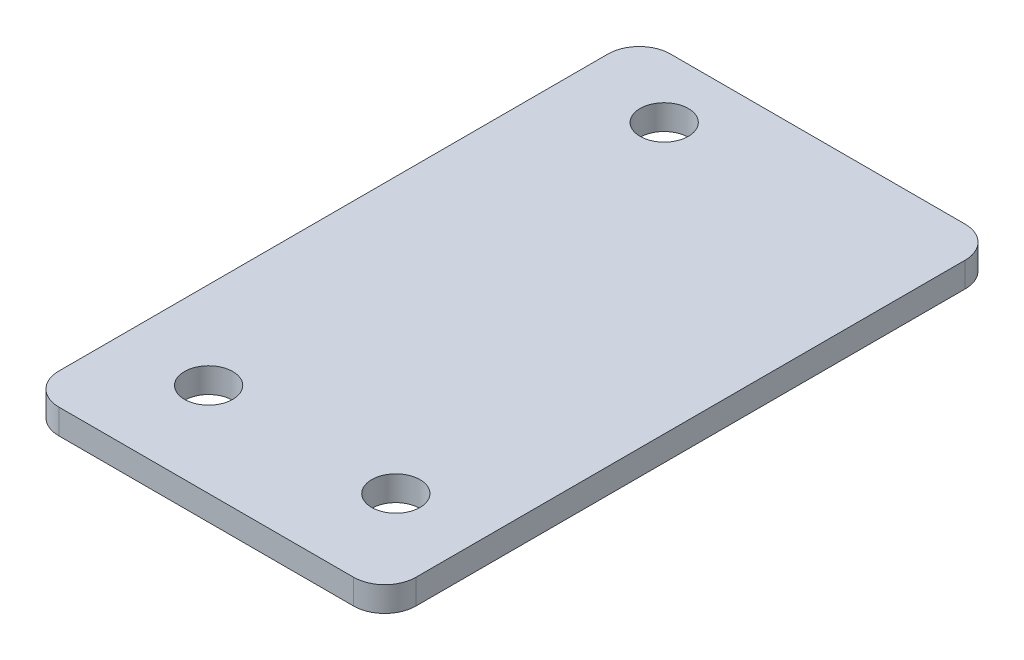
ISO-10303-21;
HEADER;
FILE_DESCRIPTION(('STEP AP214'),'2;1');
FILE_NAME('part.step','',(''),(''),'','','');
FILE_SCHEMA(('AUTOMOTIVE_DESIGN { 1 0 10303 214 1 1 1 1 }'));
ENDSEC;
DATA;
#1=APPLICATION_CONTEXT('core data for automotive mechanical design processes');
#2=APPLICATION_PROTOCOL_DEFINITION('international standard','automotive_design',2000,#1);
#3=PRODUCT_CONTEXT('',#1,'mechanical');
#4=PRODUCT('Part','Part','',(#3));
#5=PRODUCT_RELATED_PRODUCT_CATEGORY('part','',(#4));
#6=PRODUCT_DEFINITION_FORMATION('','',#4);
#7=PRODUCT_DEFINITION_CONTEXT('part definition',#1,'design');
#8=PRODUCT_DEFINITION('design','',#6,#7);
#9=PRODUCT_DEFINITION_SHAPE('','',#8);
#10=(LENGTH_UNIT() NAMED_UNIT(*) SI_UNIT(.MILLI.,.METRE.));
#11=(NAMED_UNIT(*) PLANE_ANGLE_UNIT() SI_UNIT($,.RADIAN.));
#12=(NAMED_UNIT(*) SI_UNIT($,.STERADIAN.) SOLID_ANGLE_UNIT());
#13=UNCERTAINTY_MEASURE_WITH_UNIT(LENGTH_MEASURE(1.E-05),#10,'distance_accuracy_value','');
#14=(GEOMETRIC_REPRESENTATION_CONTEXT(3) GLOBAL_UNCERTAINTY_ASSIGNED_CONTEXT((#13)) GLOBAL_UNIT_ASSIGNED_CONTEXT((#10,
#11,#12)) REPRESENTATION_CONTEXT('',''));
#15=CARTESIAN_POINT('',(0.,0.,0.));
#16=DIRECTION('',(0.,0.,1.));
#17=DIRECTION('',(1.,0.,0.));
#18=AXIS2_PLACEMENT_3D('',#15,#16,#17);
#19=CARTESIAN_POINT('',(33.1643599999993,-2.54,1.67766778092999));
#20=DIRECTION('',(0.,1.,0.));
#21=DIRECTION('',(0.,0.,1.));
#22=AXIS2_PLACEMENT_3D('',#19,#20,#21);
#23=CYLINDRICAL_SURFACE('',#22,3.175);
#24=CARTESIAN_POINT('',(33.1643599999993,0.,1.67766778092999));
#25=DIRECTION('',(0.,1.,0.));
#26=DIRECTION('',(0.,0.,-1.));
#27=AXIS2_PLACEMENT_3D('',#24,#25,#26);
#28=CIRCLE('',#27,3.175);
#29=CARTESIAN_POINT('',(33.1643599999993,0.,4.85266778092999));
#30=VERTEX_POINT('',#29);
#31=CARTESIAN_POINT('',(36.3393599999993,0.,1.67766778092999));
#32=VERTEX_POINT('',#31);
#33=EDGE_CURVE('E130',#30,#32,#28,.T.);
#34=ORIENTED_EDGE('',*,*,#33,.F.);
#35=DIRECTION('',(0.,1.,0.));
#36=VECTOR('',#35,1.);
#37=CARTESIAN_POINT('',(33.1643599999993,-2.54,4.85266778092999));
#38=LINE('',#37,#36);
#39=CARTESIAN_POINT('',(33.1643599999993,-2.54,4.85266778092999));
#40=VERTEX_POINT('',#39);
#41=EDGE_CURVE('E11',#40,#30,#38,.T.);
#42=ORIENTED_EDGE('',*,*,#41,.F.);
#43=CARTESIAN_POINT('',(33.1643599999993,-2.54,1.67766778092999));
#44=DIRECTION('',(0.,1.,0.));
#45=DIRECTION('',(0.,0.,-1.));
#46=AXIS2_PLACEMENT_3D('',#43,#44,#45);
#47=CIRCLE('',#46,3.175);
#48=CARTESIAN_POINT('',(36.3393599999993,-2.54,1.67766778092999));
#49=VERTEX_POINT('',#48);
#50=EDGE_CURVE('E151',#40,#49,#47,.T.);
#51=ORIENTED_EDGE('',*,*,#50,.T.);
#52=DIRECTION('',(0.,1.,0.));
#53=VECTOR('',#52,1.);
#54=CARTESIAN_POINT('',(36.3393599999993,-2.54,1.67766778092999));
#55=LINE('',#54,#53);
#56=EDGE_CURVE('E36',#49,#32,#55,.T.);
#57=ORIENTED_EDGE('',*,*,#56,.T.);
#58=EDGE_LOOP('',(#34,#42,#51,#57));
#59=FACE_BOUND('',#58,.T.);
#60=ADVANCED_FACE('F33',(#59),#23,.T.);
#61=CARTESIAN_POINT('',(3.175,-2.54,4.85266778092999));
#62=DIRECTION('',(0.,0.,1.));
#63=DIRECTION('',(1.,0.,0.));
#64=AXIS2_PLACEMENT_3D('',#61,#62,#63);
#65=PLANE('',#64);
#66=DIRECTION('',(1.,0.,0.));
#67=VECTOR('',#66,1.);
#68=CARTESIAN_POINT('',(3.175,0.,4.85266778092999));
#69=LINE('',#68,#67);
#70=CARTESIAN_POINT('',(3.175,0.,4.85266778092999));
#71=VERTEX_POINT('',#70);
#72=EDGE_CURVE('E149',#71,#30,#69,.T.);
#73=ORIENTED_EDGE('',*,*,#72,.F.);
#74=DIRECTION('',(0.,1.,0.));
#75=VECTOR('',#74,1.);
#76=CARTESIAN_POINT('',(3.175,-2.54,4.85266778092999));
#77=LINE('',#76,#75);
#78=CARTESIAN_POINT('',(3.175,-2.54,4.85266778092999));
#79=VERTEX_POINT('',#78);
#80=EDGE_CURVE('E42',#79,#71,#77,.T.);
#81=ORIENTED_EDGE('',*,*,#80,.F.);
#82=DIRECTION('',(1.,0.,0.));
#83=VECTOR('',#82,1.);
#84=CARTESIAN_POINT('',(3.175,-2.54,4.85266778092999));
#85=LINE('',#84,#83);
#86=EDGE_CURVE('E120',#79,#40,#85,.T.);
#87=ORIENTED_EDGE('',*,*,#86,.T.);
#88=ORIENTED_EDGE('',*,*,#41,.T.);
#89=EDGE_LOOP('',(#73,#81,#87,#88));
#90=FACE_BOUND('',#89,.T.);
#91=ADVANCED_FACE('F163',(#90),#65,.T.);
#92=CARTESIAN_POINT('',(3.175,-2.54,1.67766778092999));
#93=DIRECTION('',(0.,1.,0.));
#94=DIRECTION('',(0.,0.,1.));
#95=AXIS2_PLACEMENT_3D('',#92,#93,#94);
#96=CYLINDRICAL_SURFACE('',#95,3.175);
#97=CARTESIAN_POINT('',(3.175,0.,1.67766778092999));
#98=DIRECTION('',(0.,1.,0.));
#99=DIRECTION('',(0.,0.,1.));
#100=AXIS2_PLACEMENT_3D('',#97,#98,#99);
#101=CIRCLE('',#100,3.175);
#102=CARTESIAN_POINT('',(0.,0.,1.67766778092999));
#103=VERTEX_POINT('',#102);
#104=EDGE_CURVE('E107',#103,#71,#101,.T.);
#105=ORIENTED_EDGE('',*,*,#104,.F.);
#106=DIRECTION('',(0.,1.,0.));
#107=VECTOR('',#106,1.);
#108=CARTESIAN_POINT('',(0.,-2.54,1.67766778092999));
#109=LINE('',#108,#107);
#110=CARTESIAN_POINT('',(0.,-2.54,1.67766778092999));
#111=VERTEX_POINT('',#110);
#112=EDGE_CURVE('E102',#111,#103,#109,.T.);
#113=ORIENTED_EDGE('',*,*,#112,.F.);
#114=CARTESIAN_POINT('',(3.175,-2.54,1.67766778092999));
#115=DIRECTION('',(0.,1.,0.));
#116=DIRECTION('',(0.,0.,1.));
#117=AXIS2_PLACEMENT_3D('',#114,#115,#116);
#118=CIRCLE('',#117,3.175);
#119=EDGE_CURVE('E105',#111,#79,#118,.T.);
#120=ORIENTED_EDGE('',*,*,#119,.T.);
#121=ORIENTED_EDGE('',*,*,#80,.T.);
#122=EDGE_LOOP('',(#105,#113,#120,#121));
#123=FACE_BOUND('',#122,.T.);
#124=ADVANCED_FACE('F104',(#123),#96,.T.);
#125=CARTESIAN_POINT('',(0.,-2.54,1.67766778092999));
#126=DIRECTION('',(-1.,0.,0.));
#127=DIRECTION('',(0.,0.,1.));
#128=AXIS2_PLACEMENT_3D('',#125,#126,#127);
#129=PLANE('',#128);
#130=DIRECTION('',(0.,0.,1.));
#131=VECTOR('',#130,1.);
#132=CARTESIAN_POINT('',(0.,0.,1.67766778092999));
#133=LINE('',#132,#131);
#134=CARTESIAN_POINT('',(0.,0.,-54.20233221907));
#135=VERTEX_POINT('',#134);
#136=EDGE_CURVE('E146',#135,#103,#133,.T.);
#137=ORIENTED_EDGE('',*,*,#136,.F.);
#138=DIRECTION('',(0.,1.,0.));
#139=VECTOR('',#138,1.);
#140=CARTESIAN_POINT('',(0.,-2.54,-54.20233221907));
#141=LINE('',#140,#139);
#142=CARTESIAN_POINT('',(0.,-2.54,-54.20233221907));
#143=VERTEX_POINT('',#142);
#144=EDGE_CURVE('E112',#143,#135,#141,.T.);
#145=ORIENTED_EDGE('',*,*,#144,.F.);
#146=DIRECTION('',(0.,0.,1.));
#147=VECTOR('',#146,1.);
#148=CARTESIAN_POINT('',(0.,-2.54,1.67766778092999));
#149=LINE('',#148,#147);
#150=EDGE_CURVE('E118',#143,#111,#149,.T.);
#151=ORIENTED_EDGE('',*,*,#150,.T.);
#152=ORIENTED_EDGE('',*,*,#112,.T.);
#153=EDGE_LOOP('',(#137,#145,#151,#152));
#154=FACE_BOUND('',#153,.T.);
#155=ADVANCED_FACE('F122',(#154),#129,.T.);
#156=CARTESIAN_POINT('',(3.175,-2.54,-54.20233221907));
#157=DIRECTION('',(0.,1.,0.));
#158=DIRECTION('',(0.,0.,1.));
#159=AXIS2_PLACEMENT_3D('',#156,#157,#158);
#160=CYLINDRICAL_SURFACE('',#159,3.175);
#161=CARTESIAN_POINT('',(3.175,0.,-54.20233221907));
#162=DIRECTION('',(0.,1.,0.));
#163=DIRECTION('',(0.,0.,-1.));
#164=AXIS2_PLACEMENT_3D('',#161,#162,#163);
#165=CIRCLE('',#164,3.175);
#166=CARTESIAN_POINT('',(3.175,0.,-57.37733221907));
#167=VERTEX_POINT('',#166);
#168=EDGE_CURVE('E143',#167,#135,#165,.T.);
#169=ORIENTED_EDGE('',*,*,#168,.F.);
#170=DIRECTION('',(0.,1.,0.));
#171=VECTOR('',#170,1.);
#172=CARTESIAN_POINT('',(3.175,-2.54,-57.37733221907));
#173=LINE('',#172,#171);
#174=CARTESIAN_POINT('',(3.175,-2.54,-57.37733221907));
#175=VERTEX_POINT('',#174);
#176=EDGE_CURVE('E155',#175,#167,#173,.T.);
#177=ORIENTED_EDGE('',*,*,#176,.F.);
#178=CARTESIAN_POINT('',(3.175,-2.54,-54.20233221907));
#179=DIRECTION('',(0.,1.,0.));
#180=DIRECTION('',(0.,0.,-1.));
#181=AXIS2_PLACEMENT_3D('',#178,#179,#180);
#182=CIRCLE('',#181,3.175);
#183=EDGE_CURVE('E123',#175,#143,#182,.T.);
#184=ORIENTED_EDGE('',*,*,#183,.T.);
#185=ORIENTED_EDGE('',*,*,#144,.T.);
#186=EDGE_LOOP('',(#169,#177,#184,#185));
#187=FACE_BOUND('',#186,.T.);
#188=ADVANCED_FACE('F176',(#187),#160,.T.);
#189=CARTESIAN_POINT('',(3.175,-2.54,-57.37733221907));
#190=DIRECTION('',(0.,0.,-1.));
#191=DIRECTION('',(-1.,0.,0.));
#192=AXIS2_PLACEMENT_3D('',#189,#190,#191);
#193=PLANE('',#192);
#194=DIRECTION('',(-1.,0.,0.));
#195=VECTOR('',#194,1.);
#196=CARTESIAN_POINT('',(3.175,0.,-57.37733221907));
#197=LINE('',#196,#195);
#198=CARTESIAN_POINT('',(33.1643599999993,0.,-57.37733221907));
#199=VERTEX_POINT('',#198);
#200=EDGE_CURVE('E140',#199,#167,#197,.T.);
#201=ORIENTED_EDGE('',*,*,#200,.F.);
#202=DIRECTION('',(0.,1.,0.));
#203=VECTOR('',#202,1.);
#204=CARTESIAN_POINT('',(33.1643599999993,-2.54,-57.37733221907));
#205=LINE('',#204,#203);
#206=CARTESIAN_POINT('',(33.1643599999993,-2.54,-57.37733221907));
#207=VERTEX_POINT('',#206);
#208=EDGE_CURVE('E157',#207,#199,#205,.T.);
#209=ORIENTED_EDGE('',*,*,#208,.F.);
#210=DIRECTION('',(-1.,0.,0.));
#211=VECTOR('',#210,1.);
#212=CARTESIAN_POINT('',(3.175,-2.54,-57.37733221907));
#213=LINE('',#212,#211);
#214=EDGE_CURVE('E125',#207,#175,#213,.T.);
#215=ORIENTED_EDGE('',*,*,#214,.T.);
#216=ORIENTED_EDGE('',*,*,#176,.T.);
#217=EDGE_LOOP('',(#201,#209,#215,#216));
#218=FACE_BOUND('',#217,.T.);
#219=ADVANCED_FACE('F179',(#218),#193,.T.);
#220=CARTESIAN_POINT('',(33.1643599999993,-2.54,-54.20233221907));
#221=DIRECTION('',(0.,1.,0.));
#222=DIRECTION('',(0.,0.,1.));
#223=AXIS2_PLACEMENT_3D('',#220,#221,#222);
#224=CYLINDRICAL_SURFACE('',#223,3.175);
#225=CARTESIAN_POINT('',(33.1643599999993,0.,-54.20233221907));
#226=DIRECTION('',(0.,1.,0.));
#227=DIRECTION('',(0.,0.,1.));
#228=AXIS2_PLACEMENT_3D('',#225,#226,#227);
#229=CIRCLE('',#228,3.175);
#230=CARTESIAN_POINT('',(36.3393599999993,0.,-54.20233221907));
#231=VERTEX_POINT('',#230);
#232=EDGE_CURVE('E137',#231,#199,#229,.T.);
#233=ORIENTED_EDGE('',*,*,#232,.F.);
#234=DIRECTION('',(0.,1.,0.));
#235=VECTOR('',#234,1.);
#236=CARTESIAN_POINT('',(36.3393599999993,-2.54,-54.20233221907));
#237=LINE('',#236,#235);
#238=CARTESIAN_POINT('',(36.3393599999993,-2.54,-54.20233221907));
#239=VERTEX_POINT('',#238);
#240=EDGE_CURVE('E158',#239,#231,#237,.T.);
#241=ORIENTED_EDGE('',*,*,#240,.F.);
#242=CARTESIAN_POINT('',(33.1643599999993,-2.54,-54.20233221907));
#243=DIRECTION('',(0.,1.,0.));
#244=DIRECTION('',(0.,0.,1.));
#245=AXIS2_PLACEMENT_3D('',#242,#243,#244);
#246=CIRCLE('',#245,3.175);
#247=EDGE_CURVE('E235',#239,#207,#246,.T.);
#248=ORIENTED_EDGE('',*,*,#247,.T.);
#249=ORIENTED_EDGE('',*,*,#208,.T.);
#250=EDGE_LOOP('',(#233,#241,#248,#249));
#251=FACE_BOUND('',#250,.T.);
#252=ADVANCED_FACE('F183',(#251),#224,.T.);
#253=CARTESIAN_POINT('',(36.3393599999993,-2.54,1.67766778092999));
#254=DIRECTION('',(1.,0.,0.));
#255=DIRECTION('',(0.,0.,-1.));
#256=AXIS2_PLACEMENT_3D('',#253,#254,#255);
#257=PLANE('',#256);
#258=DIRECTION('',(0.,0.,-1.));
#259=VECTOR('',#258,1.);
#260=CARTESIAN_POINT('',(36.3393599999993,0.,1.67766778092999));
#261=LINE('',#260,#259);
#262=EDGE_CURVE('E133',#32,#231,#261,.T.);
#263=ORIENTED_EDGE('',*,*,#262,.F.);
#264=ORIENTED_EDGE('',*,*,#56,.F.);
#265=DIRECTION('',(0.,0.,-1.));
#266=VECTOR('',#265,1.);
#267=CARTESIAN_POINT('',(36.3393599999993,-2.54,1.67766778092999));
#268=LINE('',#267,#266);
#269=EDGE_CURVE('E233',#49,#239,#268,.T.);
#270=ORIENTED_EDGE('',*,*,#269,.T.);
#271=ORIENTED_EDGE('',*,*,#240,.T.);
#272=EDGE_LOOP('',(#263,#264,#270,#271));
#273=FACE_BOUND('',#272,.T.);
#274=ADVANCED_FACE('F160',(#273),#257,.T.);
#275=CARTESIAN_POINT('',(33.1643599999993,-2.54,1.67766778092999));
#276=DIRECTION('',(0.,-1.,0.));
#277=DIRECTION('',(0.,0.,-1.));
#278=AXIS2_PLACEMENT_3D('',#275,#276,#277);
#279=PLANE('',#278);
#280=CARTESIAN_POINT('',(8.89000000000093,-2.54,-4.67233221907));
#281=DIRECTION('',(0.,1.,0.));
#282=DIRECTION('',(0.,0.,1.));
#283=AXIS2_PLACEMENT_3D('',#280,#281,#282);
#284=CIRCLE('',#283,2.45744999998808);
#285=CARTESIAN_POINT('',(8.89000000000093,-2.54,-2.21488221908192));
#286=VERTEX_POINT('',#285);
#287=EDGE_CURVE('E214',#286,#286,#284,.T.);
#288=ORIENTED_EDGE('',*,*,#287,.T.);
#289=EDGE_LOOP('',(#288));
#290=FACE_BOUND('',#289,.T.);
#291=CARTESIAN_POINT('',(27.9400000000009,-2.54,-4.67233221907001));
#292=DIRECTION('',(0.,1.,0.));
#293=DIRECTION('',(0.,0.,1.));
#294=AXIS2_PLACEMENT_3D('',#291,#292,#293);
#295=CIRCLE('',#294,2.45744999998814);
#296=CARTESIAN_POINT('',(27.9400000000009,-2.54,-2.21488221908188));
#297=VERTEX_POINT('',#296);
#298=EDGE_CURVE('E222',#297,#297,#295,.T.);
#299=ORIENTED_EDGE('',*,*,#298,.T.);
#300=EDGE_LOOP('',(#299));
#301=FACE_BOUND('',#300,.T.);
#302=CARTESIAN_POINT('',(8.89000000000093,-2.54,-51.02733221907));
#303=DIRECTION('',(0.,1.,0.));
#304=DIRECTION('',(0.,0.,1.));
#305=AXIS2_PLACEMENT_3D('',#302,#303,#304);
#306=CIRCLE('',#305,2.45744999998762);
#307=CARTESIAN_POINT('',(8.89000000000093,-2.54,-48.5698822190824));
#308=VERTEX_POINT('',#307);
#309=EDGE_CURVE('E134',#308,#308,#306,.T.);
#310=ORIENTED_EDGE('',*,*,#309,.T.);
#311=EDGE_LOOP('',(#310));
#312=FACE_BOUND('',#311,.T.);
#313=ORIENTED_EDGE('',*,*,#50,.F.);
#314=ORIENTED_EDGE('',*,*,#86,.F.);
#315=ORIENTED_EDGE('',*,*,#119,.F.);
#316=ORIENTED_EDGE('',*,*,#150,.F.);
#317=ORIENTED_EDGE('',*,*,#183,.F.);
#318=ORIENTED_EDGE('',*,*,#214,.F.);
#319=ORIENTED_EDGE('',*,*,#247,.F.);
#320=ORIENTED_EDGE('',*,*,#269,.F.);
#321=EDGE_LOOP('',(#313,#314,#315,#316,#317,#318,#319,#320));
#322=FACE_BOUND('',#321,.T.);
#323=ADVANCED_FACE('F116',(#290,#301,#312,#322),#279,.T.);
#324=CARTESIAN_POINT('',(33.1643599999993,0.,1.67766778092999));
#325=DIRECTION('',(0.,-1.,0.));
#326=DIRECTION('',(0.,0.,-1.));
#327=AXIS2_PLACEMENT_3D('',#324,#325,#326);
#328=PLANE('',#327);
#329=CARTESIAN_POINT('',(8.89000000000093,0.,-4.67233221907));
#330=DIRECTION('',(0.,1.,0.));
#331=DIRECTION('',(0.,0.,1.));
#332=AXIS2_PLACEMENT_3D('',#329,#330,#331);
#333=CIRCLE('',#332,2.45744999998808);
#334=CARTESIAN_POINT('',(8.89000000000093,0.,-2.21488221908192));
#335=VERTEX_POINT('',#334);
#336=EDGE_CURVE('E217',#335,#335,#333,.T.);
#337=ORIENTED_EDGE('',*,*,#336,.F.);
#338=EDGE_LOOP('',(#337));
#339=FACE_BOUND('',#338,.T.);
#340=CARTESIAN_POINT('',(27.9400000000009,0.,-4.67233221907001));
#341=DIRECTION('',(0.,1.,0.));
#342=DIRECTION('',(0.,0.,1.));
#343=AXIS2_PLACEMENT_3D('',#340,#341,#342);
#344=CIRCLE('',#343,2.45744999998814);
#345=CARTESIAN_POINT('',(27.9400000000009,0.,-2.21488221908188));
#346=VERTEX_POINT('',#345);
#347=EDGE_CURVE('E219',#346,#346,#344,.T.);
#348=ORIENTED_EDGE('',*,*,#347,.F.);
#349=EDGE_LOOP('',(#348));
#350=FACE_BOUND('',#349,.T.);
#351=CARTESIAN_POINT('',(8.89000000000093,0.,-51.02733221907));
#352=DIRECTION('',(0.,1.,0.));
#353=DIRECTION('',(0.,0.,1.));
#354=AXIS2_PLACEMENT_3D('',#351,#352,#353);
#355=CIRCLE('',#354,2.45744999998762);
#356=CARTESIAN_POINT('',(8.89000000000093,0.,-48.5698822190824));
#357=VERTEX_POINT('',#356);
#358=EDGE_CURVE('E225',#357,#357,#355,.T.);
#359=ORIENTED_EDGE('',*,*,#358,.F.);
#360=EDGE_LOOP('',(#359));
#361=FACE_BOUND('',#360,.T.);
#362=ORIENTED_EDGE('',*,*,#33,.T.);
#363=ORIENTED_EDGE('',*,*,#262,.T.);
#364=ORIENTED_EDGE('',*,*,#232,.T.);
#365=ORIENTED_EDGE('',*,*,#200,.T.);
#366=ORIENTED_EDGE('',*,*,#168,.T.);
#367=ORIENTED_EDGE('',*,*,#136,.T.);
#368=ORIENTED_EDGE('',*,*,#104,.T.);
#369=ORIENTED_EDGE('',*,*,#72,.T.);
#370=EDGE_LOOP('',(#362,#363,#364,#365,#366,#367,#368,#369));
#371=FACE_BOUND('',#370,.T.);
#372=ADVANCED_FACE('F162',(#339,#350,#361,#371),#328,.F.);
#373=CARTESIAN_POINT('',(8.89000000000093,-2.54,-51.02733221907));
#374=DIRECTION('',(0.,1.,0.));
#375=DIRECTION('',(0.,0.,1.));
#376=AXIS2_PLACEMENT_3D('',#373,#374,#375);
#377=CYLINDRICAL_SURFACE('',#376,2.45744999998762);
#378=ORIENTED_EDGE('',*,*,#309,.F.);
#379=EDGE_LOOP('',(#378));
#380=FACE_BOUND('',#379,.T.);
#381=ORIENTED_EDGE('',*,*,#358,.T.);
#382=EDGE_LOOP('',(#381));
#383=FACE_BOUND('',#382,.T.);
#384=ADVANCED_FACE('F195',(#380,#383),#377,.F.);
#385=CARTESIAN_POINT('',(27.9400000000009,-2.54,-4.67233221907001));
#386=DIRECTION('',(0.,1.,0.));
#387=DIRECTION('',(0.,0.,1.));
#388=AXIS2_PLACEMENT_3D('',#385,#386,#387);
#389=CYLINDRICAL_SURFACE('',#388,2.45744999998814);
#390=ORIENTED_EDGE('',*,*,#298,.F.);
#391=EDGE_LOOP('',(#390));
#392=FACE_BOUND('',#391,.T.);
#393=ORIENTED_EDGE('',*,*,#347,.T.);
#394=EDGE_LOOP('',(#393));
#395=FACE_BOUND('',#394,.T.);
#396=ADVANCED_FACE('F202',(#392,#395),#389,.F.);
#397=CARTESIAN_POINT('',(8.89000000000093,-2.54,-4.67233221907));
#398=DIRECTION('',(0.,1.,0.));
#399=DIRECTION('',(0.,0.,1.));
#400=AXIS2_PLACEMENT_3D('',#397,#398,#399);
#401=CYLINDRICAL_SURFACE('',#400,2.45744999998808);
#402=ORIENTED_EDGE('',*,*,#287,.F.);
#403=EDGE_LOOP('',(#402));
#404=FACE_BOUND('',#403,.T.);
#405=ORIENTED_EDGE('',*,*,#336,.T.);
#406=EDGE_LOOP('',(#405));
#407=FACE_BOUND('',#406,.T.);
#408=ADVANCED_FACE('F206',(#404,#407),#401,.F.);
#409=CLOSED_SHELL('',(#60,#91,#124,#155,#188,#219,#252,#274,#323,#372,#384,#396,#408));
#410=MANIFOLD_SOLID_BREP('B2',#409);
#411=ADVANCED_BREP_SHAPE_REPRESENTATION('',(#18,#410),#14);
#412=SHAPE_DEFINITION_REPRESENTATION(#9,#411);
ENDSEC;
END-ISO-10303-21;
